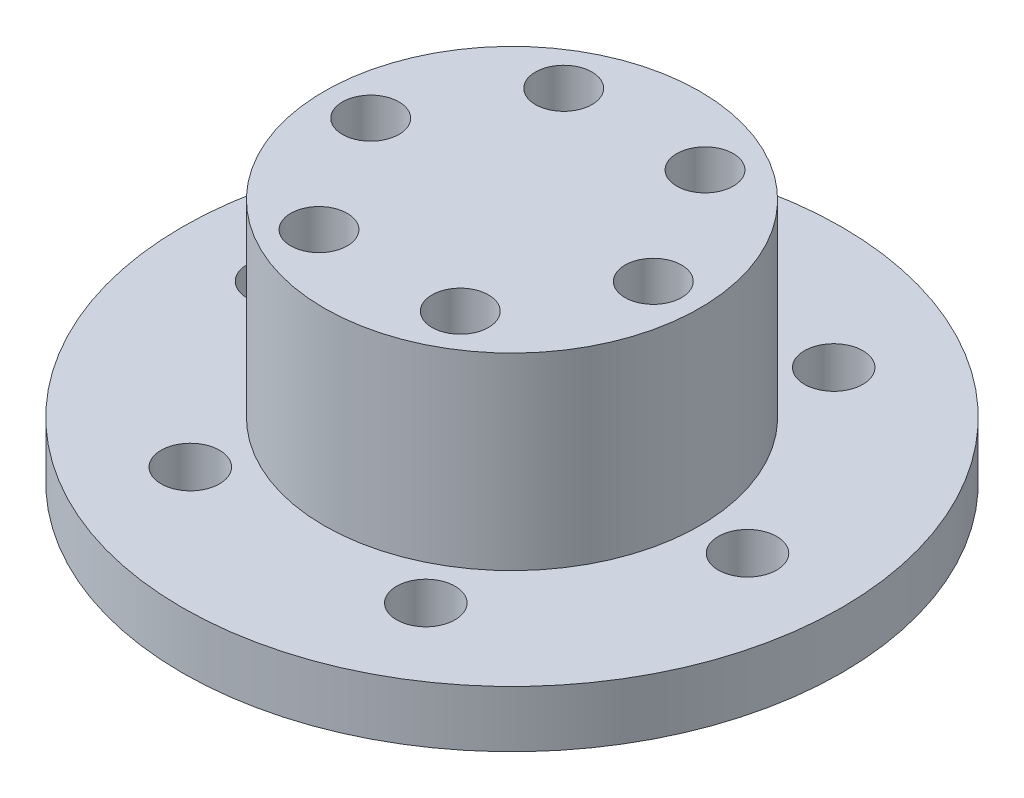
ISO-10303-21;
HEADER;
FILE_DESCRIPTION(('STEP AP214'),'2;1');
FILE_NAME('part.step','',(''),(''),'','','');
FILE_SCHEMA(('AUTOMOTIVE_DESIGN { 1 0 10303 214 1 1 1 1 }'));
ENDSEC;
DATA;
#1=APPLICATION_CONTEXT('core data for automotive mechanical design processes');
#2=APPLICATION_PROTOCOL_DEFINITION('international standard','automotive_design',2000,#1);
#3=PRODUCT_CONTEXT('',#1,'mechanical');
#4=PRODUCT('Part','Part','',(#3));
#5=PRODUCT_RELATED_PRODUCT_CATEGORY('part','',(#4));
#6=PRODUCT_DEFINITION_FORMATION('','',#4);
#7=PRODUCT_DEFINITION_CONTEXT('part definition',#1,'design');
#8=PRODUCT_DEFINITION('design','',#6,#7);
#9=PRODUCT_DEFINITION_SHAPE('','',#8);
#10=(LENGTH_UNIT() NAMED_UNIT(*) SI_UNIT(.MILLI.,.METRE.));
#11=(NAMED_UNIT(*) PLANE_ANGLE_UNIT() SI_UNIT($,.RADIAN.));
#12=(NAMED_UNIT(*) SI_UNIT($,.STERADIAN.) SOLID_ANGLE_UNIT());
#13=UNCERTAINTY_MEASURE_WITH_UNIT(LENGTH_MEASURE(1.E-05),#10,'distance_accuracy_value','');
#14=(GEOMETRIC_REPRESENTATION_CONTEXT(3) GLOBAL_UNCERTAINTY_ASSIGNED_CONTEXT((#13)) GLOBAL_UNIT_ASSIGNED_CONTEXT((#10,
#11,#12)) REPRESENTATION_CONTEXT('',''));
#15=CARTESIAN_POINT('',(0.,0.,0.));
#16=DIRECTION('',(0.,0.,1.));
#17=DIRECTION('',(1.,0.,0.));
#18=AXIS2_PLACEMENT_3D('',#15,#16,#17);
#19=CARTESIAN_POINT('',(0.,3.,0.));
#20=DIRECTION('',(0.,1.,0.));
#21=DIRECTION('',(0.,0.,1.));
#22=AXIS2_PLACEMENT_3D('',#19,#20,#21);
#23=PLANE('',#22);
#24=CARTESIAN_POINT('',(0.,3.,0.));
#25=DIRECTION('',(0.,1.,0.));
#26=DIRECTION('',(0.,0.,1.));
#27=AXIS2_PLACEMENT_3D('',#24,#25,#26);
#28=CIRCLE('',#27,9.97);
#29=CARTESIAN_POINT('',(0.,3.,9.97));
#30=VERTEX_POINT('',#29);
#31=EDGE_CURVE('E100',#30,#30,#28,.T.);
#32=ORIENTED_EDGE('',*,*,#31,.F.);
#33=EDGE_LOOP('',(#32));
#34=FACE_BOUND('',#33,.T.);
#35=CARTESIAN_POINT('',(-6.2499999999999,3.,-10.8253175473055));
#36=DIRECTION('',(0.,1.,0.));
#37=DIRECTION('',(0.,0.,1.));
#38=AXIS2_PLACEMENT_3D('',#35,#36,#37);
#39=CIRCLE('',#38,1.55);
#40=CARTESIAN_POINT('',(-6.2499999999999,3.,-9.27531754730554));
#41=VERTEX_POINT('',#40);
#42=EDGE_CURVE('E85',#41,#41,#39,.T.);
#43=ORIENTED_EDGE('',*,*,#42,.F.);
#44=EDGE_LOOP('',(#43));
#45=FACE_BOUND('',#44,.T.);
#46=CARTESIAN_POINT('',(-6.25000000000005,3.,10.8253175473055));
#47=DIRECTION('',(0.,1.,0.));
#48=DIRECTION('',(0.,0.,1.));
#49=AXIS2_PLACEMENT_3D('',#46,#47,#48);
#50=CIRCLE('',#49,1.55);
#51=CARTESIAN_POINT('',(-6.25000000000005,3.,12.3753175473055));
#52=VERTEX_POINT('',#51);
#53=EDGE_CURVE('E73',#52,#52,#50,.T.);
#54=ORIENTED_EDGE('',*,*,#53,.F.);
#55=EDGE_LOOP('',(#54));
#56=FACE_BOUND('',#55,.T.);
#57=CARTESIAN_POINT('',(12.5,3.,0.));
#58=DIRECTION('',(0.,1.,0.));
#59=DIRECTION('',(0.,0.,1.));
#60=AXIS2_PLACEMENT_3D('',#57,#58,#59);
#61=CIRCLE('',#60,1.55);
#62=CARTESIAN_POINT('',(12.5,3.,1.55));
#63=VERTEX_POINT('',#62);
#64=EDGE_CURVE('E61',#63,#63,#61,.T.);
#65=ORIENTED_EDGE('',*,*,#64,.F.);
#66=EDGE_LOOP('',(#65));
#67=FACE_BOUND('',#66,.T.);
#68=CARTESIAN_POINT('',(0.,3.,0.));
#69=DIRECTION('',(0.,1.,0.));
#70=DIRECTION('',(0.,0.,1.));
#71=AXIS2_PLACEMENT_3D('',#68,#69,#70);
#72=CIRCLE('',#71,17.5);
#73=CARTESIAN_POINT('',(0.,3.,17.5));
#74=VERTEX_POINT('',#73);
#75=EDGE_CURVE('E57',#74,#74,#72,.T.);
#76=ORIENTED_EDGE('',*,*,#75,.T.);
#77=EDGE_LOOP('',(#76));
#78=FACE_BOUND('',#77,.T.);
#79=CARTESIAN_POINT('',(6.24999999999998,3.,10.8253175473055));
#80=DIRECTION('',(0.,1.,0.));
#81=DIRECTION('',(0.,0.,1.));
#82=AXIS2_PLACEMENT_3D('',#79,#80,#81);
#83=CIRCLE('',#82,1.55);
#84=CARTESIAN_POINT('',(6.24999999999998,3.,12.3753175473055));
#85=VERTEX_POINT('',#84);
#86=EDGE_CURVE('E67',#85,#85,#83,.T.);
#87=ORIENTED_EDGE('',*,*,#86,.F.);
#88=EDGE_LOOP('',(#87));
#89=FACE_BOUND('',#88,.T.);
#90=CARTESIAN_POINT('',(-12.5,3.,0.));
#91=DIRECTION('',(0.,1.,0.));
#92=DIRECTION('',(0.,0.,1.));
#93=AXIS2_PLACEMENT_3D('',#90,#91,#92);
#94=CIRCLE('',#93,1.55);
#95=CARTESIAN_POINT('',(-12.5,3.,1.54999999999991));
#96=VERTEX_POINT('',#95);
#97=EDGE_CURVE('E79',#96,#96,#94,.T.);
#98=ORIENTED_EDGE('',*,*,#97,.F.);
#99=EDGE_LOOP('',(#98));
#100=FACE_BOUND('',#99,.T.);
#101=CARTESIAN_POINT('',(6.25000000000013,3.,-10.8253175473054));
#102=DIRECTION('',(0.,1.,0.));
#103=DIRECTION('',(0.,0.,1.));
#104=AXIS2_PLACEMENT_3D('',#101,#102,#103);
#105=CIRCLE('',#104,1.55);
#106=CARTESIAN_POINT('',(6.25000000000013,3.,-9.27531754730541));
#107=VERTEX_POINT('',#106);
#108=EDGE_CURVE('E91',#107,#107,#105,.T.);
#109=ORIENTED_EDGE('',*,*,#108,.F.);
#110=EDGE_LOOP('',(#109));
#111=FACE_BOUND('',#110,.T.);
#112=ADVANCED_FACE('F31',(#34,#45,#56,#67,#78,#89,#100,#111),#23,.T.);
#113=CARTESIAN_POINT('',(0.,0.,0.));
#114=DIRECTION('',(0.,1.,0.));
#115=DIRECTION('',(0.,0.,1.));
#116=AXIS2_PLACEMENT_3D('',#113,#114,#115);
#117=PLANE('',#116);
#118=CARTESIAN_POINT('',(0.,0.,0.));
#119=DIRECTION('',(0.,1.,0.));
#120=DIRECTION('',(0.,0.,1.));
#121=AXIS2_PLACEMENT_3D('',#118,#119,#120);
#122=CIRCLE('',#121,17.5);
#123=CARTESIAN_POINT('',(0.,0.,17.5));
#124=VERTEX_POINT('',#123);
#125=EDGE_CURVE('E58',#124,#124,#122,.T.);
#126=ORIENTED_EDGE('',*,*,#125,.F.);
#127=EDGE_LOOP('',(#126));
#128=FACE_BOUND('',#127,.T.);
#129=CARTESIAN_POINT('',(12.5,0.,0.));
#130=DIRECTION('',(0.,1.,0.));
#131=DIRECTION('',(0.,0.,1.));
#132=AXIS2_PLACEMENT_3D('',#129,#130,#131);
#133=CIRCLE('',#132,1.55);
#134=CARTESIAN_POINT('',(12.5,0.,1.55));
#135=VERTEX_POINT('',#134);
#136=EDGE_CURVE('E64',#135,#135,#133,.T.);
#137=ORIENTED_EDGE('',*,*,#136,.T.);
#138=EDGE_LOOP('',(#137));
#139=FACE_BOUND('',#138,.T.);
#140=CARTESIAN_POINT('',(6.24999999999998,0.,10.8253175473055));
#141=DIRECTION('',(0.,1.,0.));
#142=DIRECTION('',(0.,0.,1.));
#143=AXIS2_PLACEMENT_3D('',#140,#141,#142);
#144=CIRCLE('',#143,1.55);
#145=CARTESIAN_POINT('',(6.24999999999998,0.,12.3753175473055));
#146=VERTEX_POINT('',#145);
#147=EDGE_CURVE('E70',#146,#146,#144,.T.);
#148=ORIENTED_EDGE('',*,*,#147,.T.);
#149=EDGE_LOOP('',(#148));
#150=FACE_BOUND('',#149,.T.);
#151=CARTESIAN_POINT('',(-6.25000000000005,0.,10.8253175473055));
#152=DIRECTION('',(0.,1.,0.));
#153=DIRECTION('',(0.,0.,1.));
#154=AXIS2_PLACEMENT_3D('',#151,#152,#153);
#155=CIRCLE('',#154,1.55);
#156=CARTESIAN_POINT('',(-6.25000000000005,0.,12.3753175473055));
#157=VERTEX_POINT('',#156);
#158=EDGE_CURVE('E76',#157,#157,#155,.T.);
#159=ORIENTED_EDGE('',*,*,#158,.T.);
#160=EDGE_LOOP('',(#159));
#161=FACE_BOUND('',#160,.T.);
#162=CARTESIAN_POINT('',(-12.5,0.,0.));
#163=DIRECTION('',(0.,1.,0.));
#164=DIRECTION('',(0.,0.,1.));
#165=AXIS2_PLACEMENT_3D('',#162,#163,#164);
#166=CIRCLE('',#165,1.55);
#167=CARTESIAN_POINT('',(-12.5,0.,1.54999999999991));
#168=VERTEX_POINT('',#167);
#169=EDGE_CURVE('E82',#168,#168,#166,.T.);
#170=ORIENTED_EDGE('',*,*,#169,.T.);
#171=EDGE_LOOP('',(#170));
#172=FACE_BOUND('',#171,.T.);
#173=CARTESIAN_POINT('',(-6.2499999999999,0.,-10.8253175473055));
#174=DIRECTION('',(0.,1.,0.));
#175=DIRECTION('',(0.,0.,1.));
#176=AXIS2_PLACEMENT_3D('',#173,#174,#175);
#177=CIRCLE('',#176,1.55);
#178=CARTESIAN_POINT('',(-6.2499999999999,0.,-9.27531754730554));
#179=VERTEX_POINT('',#178);
#180=EDGE_CURVE('E88',#179,#179,#177,.T.);
#181=ORIENTED_EDGE('',*,*,#180,.T.);
#182=EDGE_LOOP('',(#181));
#183=FACE_BOUND('',#182,.T.);
#184=CARTESIAN_POINT('',(6.25000000000013,0.,-10.8253175473054));
#185=DIRECTION('',(0.,1.,0.));
#186=DIRECTION('',(0.,0.,1.));
#187=AXIS2_PLACEMENT_3D('',#184,#185,#186);
#188=CIRCLE('',#187,1.55);
#189=CARTESIAN_POINT('',(6.25000000000013,0.,-9.27531754730541));
#190=VERTEX_POINT('',#189);
#191=EDGE_CURVE('E94',#190,#190,#188,.T.);
#192=ORIENTED_EDGE('',*,*,#191,.T.);
#193=EDGE_LOOP('',(#192));
#194=FACE_BOUND('',#193,.T.);
#195=ADVANCED_FACE('F147',(#128,#139,#150,#161,#172,#183,#194),#117,.F.);
#196=CARTESIAN_POINT('',(0.,3.,0.));
#197=DIRECTION('',(0.,-1.,0.));
#198=DIRECTION('',(0.,0.,-1.));
#199=AXIS2_PLACEMENT_3D('',#196,#197,#198);
#200=CYLINDRICAL_SURFACE('',#199,17.5);
#201=ORIENTED_EDGE('',*,*,#75,.F.);
#202=EDGE_LOOP('',(#201));
#203=FACE_BOUND('',#202,.T.);
#204=ORIENTED_EDGE('',*,*,#125,.T.);
#205=EDGE_LOOP('',(#204));
#206=FACE_BOUND('',#205,.T.);
#207=ADVANCED_FACE('F33',(#203,#206),#200,.T.);
#208=CARTESIAN_POINT('',(12.5,3.,0.));
#209=DIRECTION('',(0.,-1.,0.));
#210=DIRECTION('',(0.,0.,-1.));
#211=AXIS2_PLACEMENT_3D('',#208,#209,#210);
#212=CYLINDRICAL_SURFACE('',#211,1.55);
#213=ORIENTED_EDGE('',*,*,#64,.T.);
#214=EDGE_LOOP('',(#213));
#215=FACE_BOUND('',#214,.T.);
#216=ORIENTED_EDGE('',*,*,#136,.F.);
#217=EDGE_LOOP('',(#216));
#218=FACE_BOUND('',#217,.T.);
#219=ADVANCED_FACE('F323',(#215,#218),#212,.F.);
#220=CARTESIAN_POINT('',(6.24999999999998,3.,10.8253175473055));
#221=DIRECTION('',(0.,-1.,0.));
#222=DIRECTION('',(0.,0.,-1.));
#223=AXIS2_PLACEMENT_3D('',#220,#221,#222);
#224=CYLINDRICAL_SURFACE('',#223,1.55);
#225=ORIENTED_EDGE('',*,*,#86,.T.);
#226=EDGE_LOOP('',(#225));
#227=FACE_BOUND('',#226,.T.);
#228=ORIENTED_EDGE('',*,*,#147,.F.);
#229=EDGE_LOOP('',(#228));
#230=FACE_BOUND('',#229,.T.);
#231=ADVANCED_FACE('F314',(#227,#230),#224,.F.);
#232=CARTESIAN_POINT('',(-6.25000000000005,3.,10.8253175473055));
#233=DIRECTION('',(0.,-1.,0.));
#234=DIRECTION('',(0.,0.,-1.));
#235=AXIS2_PLACEMENT_3D('',#232,#233,#234);
#236=CYLINDRICAL_SURFACE('',#235,1.55);
#237=ORIENTED_EDGE('',*,*,#53,.T.);
#238=EDGE_LOOP('',(#237));
#239=FACE_BOUND('',#238,.T.);
#240=ORIENTED_EDGE('',*,*,#158,.F.);
#241=EDGE_LOOP('',(#240));
#242=FACE_BOUND('',#241,.T.);
#243=ADVANCED_FACE('F305',(#239,#242),#236,.F.);
#244=CARTESIAN_POINT('',(-12.5,3.,0.));
#245=DIRECTION('',(0.,-1.,0.));
#246=DIRECTION('',(0.,0.,-1.));
#247=AXIS2_PLACEMENT_3D('',#244,#245,#246);
#248=CYLINDRICAL_SURFACE('',#247,1.55);
#249=ORIENTED_EDGE('',*,*,#97,.T.);
#250=EDGE_LOOP('',(#249));
#251=FACE_BOUND('',#250,.T.);
#252=ORIENTED_EDGE('',*,*,#169,.F.);
#253=EDGE_LOOP('',(#252));
#254=FACE_BOUND('',#253,.T.);
#255=ADVANCED_FACE('F296',(#251,#254),#248,.F.);
#256=CARTESIAN_POINT('',(-6.2499999999999,3.,-10.8253175473055));
#257=DIRECTION('',(0.,-1.,0.));
#258=DIRECTION('',(0.,0.,-1.));
#259=AXIS2_PLACEMENT_3D('',#256,#257,#258);
#260=CYLINDRICAL_SURFACE('',#259,1.55);
#261=ORIENTED_EDGE('',*,*,#42,.T.);
#262=EDGE_LOOP('',(#261));
#263=FACE_BOUND('',#262,.T.);
#264=ORIENTED_EDGE('',*,*,#180,.F.);
#265=EDGE_LOOP('',(#264));
#266=FACE_BOUND('',#265,.T.);
#267=ADVANCED_FACE('F140',(#263,#266),#260,.F.);
#268=CARTESIAN_POINT('',(6.25000000000013,3.,-10.8253175473054));
#269=DIRECTION('',(0.,-1.,0.));
#270=DIRECTION('',(0.,0.,-1.));
#271=AXIS2_PLACEMENT_3D('',#268,#269,#270);
#272=CYLINDRICAL_SURFACE('',#271,1.55);
#273=ORIENTED_EDGE('',*,*,#108,.T.);
#274=EDGE_LOOP('',(#273));
#275=FACE_BOUND('',#274,.T.);
#276=ORIENTED_EDGE('',*,*,#191,.F.);
#277=EDGE_LOOP('',(#276));
#278=FACE_BOUND('',#277,.T.);
#279=ADVANCED_FACE('F130',(#275,#278),#272,.F.);
#280=CARTESIAN_POINT('',(0.,13.,0.));
#281=DIRECTION('',(0.,1.,0.));
#282=DIRECTION('',(0.,0.,1.));
#283=AXIS2_PLACEMENT_3D('',#280,#281,#282);
#284=PLANE('',#283);
#285=CARTESIAN_POINT('',(-3.74999999999994,13.,-6.49519052838333));
#286=DIRECTION('',(0.,1.,0.));
#287=DIRECTION('',(0.,0.,1.));
#288=AXIS2_PLACEMENT_3D('',#285,#286,#287);
#289=CIRCLE('',#288,1.5);
#290=CARTESIAN_POINT('',(-3.74999999999994,13.,-4.99519052838333));
#291=VERTEX_POINT('',#290);
#292=EDGE_CURVE('E117',#291,#291,#289,.T.);
#293=ORIENTED_EDGE('',*,*,#292,.F.);
#294=EDGE_LOOP('',(#293));
#295=FACE_BOUND('',#294,.T.);
#296=CARTESIAN_POINT('',(-3.75000000000003,13.,6.49519052838327));
#297=DIRECTION('',(0.,1.,0.));
#298=DIRECTION('',(0.,0.,1.));
#299=AXIS2_PLACEMENT_3D('',#296,#297,#298);
#300=CIRCLE('',#299,1.5);
#301=CARTESIAN_POINT('',(-3.75000000000003,13.,7.99519052838327));
#302=VERTEX_POINT('',#301);
#303=EDGE_CURVE('E111',#302,#302,#300,.T.);
#304=ORIENTED_EDGE('',*,*,#303,.F.);
#305=EDGE_LOOP('',(#304));
#306=FACE_BOUND('',#305,.T.);
#307=CARTESIAN_POINT('',(7.5,13.,0.));
#308=DIRECTION('',(0.,1.,0.));
#309=DIRECTION('',(0.,0.,1.));
#310=AXIS2_PLACEMENT_3D('',#307,#308,#309);
#311=CIRCLE('',#310,1.5);
#312=CARTESIAN_POINT('',(7.5,13.,1.5));
#313=VERTEX_POINT('',#312);
#314=EDGE_CURVE('E103',#313,#313,#311,.T.);
#315=ORIENTED_EDGE('',*,*,#314,.F.);
#316=EDGE_LOOP('',(#315));
#317=FACE_BOUND('',#316,.T.);
#318=CARTESIAN_POINT('',(0.,13.,0.));
#319=DIRECTION('',(0.,1.,0.));
#320=DIRECTION('',(0.,0.,1.));
#321=AXIS2_PLACEMENT_3D('',#318,#319,#320);
#322=CIRCLE('',#321,9.97);
#323=CARTESIAN_POINT('',(0.,13.,9.97));
#324=VERTEX_POINT('',#323);
#325=EDGE_CURVE('E97',#324,#324,#322,.T.);
#326=ORIENTED_EDGE('',*,*,#325,.T.);
#327=EDGE_LOOP('',(#326));
#328=FACE_BOUND('',#327,.T.);
#329=CARTESIAN_POINT('',(3.74999999999998,13.,6.4951905283833));
#330=DIRECTION('',(0.,1.,0.));
#331=DIRECTION('',(0.,0.,1.));
#332=AXIS2_PLACEMENT_3D('',#329,#330,#331);
#333=CIRCLE('',#332,1.5);
#334=CARTESIAN_POINT('',(3.74999999999998,13.,7.9951905283833));
#335=VERTEX_POINT('',#334);
#336=EDGE_CURVE('E108',#335,#335,#333,.T.);
#337=ORIENTED_EDGE('',*,*,#336,.F.);
#338=EDGE_LOOP('',(#337));
#339=FACE_BOUND('',#338,.T.);
#340=CARTESIAN_POINT('',(-7.5,13.,0.));
#341=DIRECTION('',(0.,1.,0.));
#342=DIRECTION('',(0.,0.,1.));
#343=AXIS2_PLACEMENT_3D('',#340,#341,#342);
#344=CIRCLE('',#343,1.5);
#345=CARTESIAN_POINT('',(-7.5,13.,1.49999999999995));
#346=VERTEX_POINT('',#345);
#347=EDGE_CURVE('E114',#346,#346,#344,.T.);
#348=ORIENTED_EDGE('',*,*,#347,.F.);
#349=EDGE_LOOP('',(#348));
#350=FACE_BOUND('',#349,.T.);
#351=CARTESIAN_POINT('',(3.75000000000008,13.,-6.49519052838325));
#352=DIRECTION('',(0.,1.,0.));
#353=DIRECTION('',(0.,0.,1.));
#354=AXIS2_PLACEMENT_3D('',#351,#352,#353);
#355=CIRCLE('',#354,1.5);
#356=CARTESIAN_POINT('',(3.75000000000008,13.,-4.99519052838325));
#357=VERTEX_POINT('',#356);
#358=EDGE_CURVE('E120',#357,#357,#355,.T.);
#359=ORIENTED_EDGE('',*,*,#358,.F.);
#360=EDGE_LOOP('',(#359));
#361=FACE_BOUND('',#360,.T.);
#362=ADVANCED_FACE('F127',(#295,#306,#317,#328,#339,#350,#361),#284,.T.);
#363=CARTESIAN_POINT('',(0.,13.,0.));
#364=DIRECTION('',(0.,-1.,0.));
#365=DIRECTION('',(0.,0.,-1.));
#366=AXIS2_PLACEMENT_3D('',#363,#364,#365);
#367=CYLINDRICAL_SURFACE('',#366,9.97);
#368=ORIENTED_EDGE('',*,*,#325,.F.);
#369=EDGE_LOOP('',(#368));
#370=FACE_BOUND('',#369,.T.);
#371=ORIENTED_EDGE('',*,*,#31,.T.);
#372=EDGE_LOOP('',(#371));
#373=FACE_BOUND('',#372,.T.);
#374=ADVANCED_FACE('F129',(#370,#373),#367,.T.);
#375=CARTESIAN_POINT('',(7.5,13.,0.));
#376=DIRECTION('',(0.,-1.,0.));
#377=DIRECTION('',(0.,0.,-1.));
#378=AXIS2_PLACEMENT_3D('',#375,#376,#377);
#379=CYLINDRICAL_SURFACE('',#378,1.5);
#380=ORIENTED_EDGE('',*,*,#314,.T.);
#381=EDGE_LOOP('',(#380));
#382=FACE_BOUND('',#381,.T.);
#383=CARTESIAN_POINT('',(7.5,3.,0.));
#384=DIRECTION('',(0.,1.,0.));
#385=DIRECTION('',(0.,0.,1.));
#386=AXIS2_PLACEMENT_3D('',#383,#384,#385);
#387=CIRCLE('',#386,1.5);
#388=CARTESIAN_POINT('',(7.5,3.,1.5));
#389=VERTEX_POINT('',#388);
#390=EDGE_CURVE('E10',#389,#389,#387,.F.);
#391=ORIENTED_EDGE('',*,*,#390,.T.);
#392=EDGE_LOOP('',(#391));
#393=FACE_BOUND('',#392,.T.);
#394=ADVANCED_FACE('F137',(#382,#393),#379,.F.);
#395=CARTESIAN_POINT('',(3.74999999999998,13.,6.4951905283833));
#396=DIRECTION('',(0.,-1.,0.));
#397=DIRECTION('',(0.,0.,-1.));
#398=AXIS2_PLACEMENT_3D('',#395,#396,#397);
#399=CYLINDRICAL_SURFACE('',#398,1.5);
#400=ORIENTED_EDGE('',*,*,#336,.T.);
#401=EDGE_LOOP('',(#400));
#402=FACE_BOUND('',#401,.T.);
#403=CARTESIAN_POINT('',(3.74999999999998,3.,6.4951905283833));
#404=DIRECTION('',(0.,1.,0.));
#405=DIRECTION('',(0.,0.,1.));
#406=AXIS2_PLACEMENT_3D('',#403,#404,#405);
#407=CIRCLE('',#406,1.5);
#408=CARTESIAN_POINT('',(3.74999999999998,3.,7.9951905283833));
#409=VERTEX_POINT('',#408);
#410=EDGE_CURVE('E38',#409,#409,#407,.F.);
#411=ORIENTED_EDGE('',*,*,#410,.T.);
#412=EDGE_LOOP('',(#411));
#413=FACE_BOUND('',#412,.T.);
#414=ADVANCED_FACE('F187',(#402,#413),#399,.F.);
#415=CARTESIAN_POINT('',(-3.75000000000003,13.,6.49519052838327));
#416=DIRECTION('',(0.,-1.,0.));
#417=DIRECTION('',(0.,0.,-1.));
#418=AXIS2_PLACEMENT_3D('',#415,#416,#417);
#419=CYLINDRICAL_SURFACE('',#418,1.5);
#420=ORIENTED_EDGE('',*,*,#303,.T.);
#421=EDGE_LOOP('',(#420));
#422=FACE_BOUND('',#421,.T.);
#423=CARTESIAN_POINT('',(-3.75000000000003,3.,6.49519052838327));
#424=DIRECTION('',(0.,1.,0.));
#425=DIRECTION('',(0.,0.,1.));
#426=AXIS2_PLACEMENT_3D('',#423,#424,#425);
#427=CIRCLE('',#426,1.5);
#428=CARTESIAN_POINT('',(-3.75000000000003,3.,7.99519052838327));
#429=VERTEX_POINT('',#428);
#430=EDGE_CURVE('E42',#429,#429,#427,.F.);
#431=ORIENTED_EDGE('',*,*,#430,.T.);
#432=EDGE_LOOP('',(#431));
#433=FACE_BOUND('',#432,.T.);
#434=ADVANCED_FACE('F183',(#422,#433),#419,.F.);
#435=CARTESIAN_POINT('',(-7.5,13.,0.));
#436=DIRECTION('',(0.,-1.,0.));
#437=DIRECTION('',(0.,0.,-1.));
#438=AXIS2_PLACEMENT_3D('',#435,#436,#437);
#439=CYLINDRICAL_SURFACE('',#438,1.5);
#440=ORIENTED_EDGE('',*,*,#347,.T.);
#441=EDGE_LOOP('',(#440));
#442=FACE_BOUND('',#441,.T.);
#443=CARTESIAN_POINT('',(-7.5,3.,0.));
#444=DIRECTION('',(0.,1.,0.));
#445=DIRECTION('',(0.,0.,1.));
#446=AXIS2_PLACEMENT_3D('',#443,#444,#445);
#447=CIRCLE('',#446,1.5);
#448=CARTESIAN_POINT('',(-7.5,3.,1.49999999999995));
#449=VERTEX_POINT('',#448);
#450=EDGE_CURVE('E46',#449,#449,#447,.F.);
#451=ORIENTED_EDGE('',*,*,#450,.T.);
#452=EDGE_LOOP('',(#451));
#453=FACE_BOUND('',#452,.T.);
#454=ADVANCED_FACE('F177',(#442,#453),#439,.F.);
#455=CARTESIAN_POINT('',(-3.74999999999994,13.,-6.49519052838333));
#456=DIRECTION('',(0.,-1.,0.));
#457=DIRECTION('',(0.,0.,-1.));
#458=AXIS2_PLACEMENT_3D('',#455,#456,#457);
#459=CYLINDRICAL_SURFACE('',#458,1.5);
#460=ORIENTED_EDGE('',*,*,#292,.T.);
#461=EDGE_LOOP('',(#460));
#462=FACE_BOUND('',#461,.T.);
#463=CARTESIAN_POINT('',(-3.74999999999994,3.,-6.49519052838333));
#464=DIRECTION('',(0.,1.,0.));
#465=DIRECTION('',(0.,0.,1.));
#466=AXIS2_PLACEMENT_3D('',#463,#464,#465);
#467=CIRCLE('',#466,1.5);
#468=CARTESIAN_POINT('',(-3.74999999999994,3.,-4.99519052838333));
#469=VERTEX_POINT('',#468);
#470=EDGE_CURVE('E51',#469,#469,#467,.F.);
#471=ORIENTED_EDGE('',*,*,#470,.T.);
#472=EDGE_LOOP('',(#471));
#473=FACE_BOUND('',#472,.T.);
#474=ADVANCED_FACE('F171',(#462,#473),#459,.F.);
#475=CARTESIAN_POINT('',(3.75000000000008,13.,-6.49519052838325));
#476=DIRECTION('',(0.,-1.,0.));
#477=DIRECTION('',(0.,0.,-1.));
#478=AXIS2_PLACEMENT_3D('',#475,#476,#477);
#479=CYLINDRICAL_SURFACE('',#478,1.5);
#480=ORIENTED_EDGE('',*,*,#358,.T.);
#481=EDGE_LOOP('',(#480));
#482=FACE_BOUND('',#481,.T.);
#483=CARTESIAN_POINT('',(3.75000000000008,3.,-6.49519052838325));
#484=DIRECTION('',(0.,1.,0.));
#485=DIRECTION('',(0.,0.,1.));
#486=AXIS2_PLACEMENT_3D('',#483,#484,#485);
#487=CIRCLE('',#486,1.5);
#488=CARTESIAN_POINT('',(3.75000000000008,3.,-4.99519052838325));
#489=VERTEX_POINT('',#488);
#490=EDGE_CURVE('E54',#489,#489,#487,.F.);
#491=ORIENTED_EDGE('',*,*,#490,.T.);
#492=EDGE_LOOP('',(#491));
#493=FACE_BOUND('',#492,.T.);
#494=ADVANCED_FACE('F124',(#482,#493),#479,.F.);
#495=ORIENTED_EDGE('',*,*,#490,.F.);
#496=EDGE_LOOP('',(#495));
#497=FACE_BOUND('',#496,.T.);
#498=ADVANCED_FACE('F151',(#497),#23,.T.);
#499=ORIENTED_EDGE('',*,*,#470,.F.);
#500=EDGE_LOOP('',(#499));
#501=FACE_BOUND('',#500,.T.);
#502=ADVANCED_FACE('F163',(#501),#23,.T.);
#503=ORIENTED_EDGE('',*,*,#450,.F.);
#504=EDGE_LOOP('',(#503));
#505=FACE_BOUND('',#504,.T.);
#506=ADVANCED_FACE('F169',(#505),#23,.T.);
#507=ORIENTED_EDGE('',*,*,#430,.F.);
#508=EDGE_LOOP('',(#507));
#509=FACE_BOUND('',#508,.T.);
#510=ADVANCED_FACE('F207',(#509),#23,.T.);
#511=ORIENTED_EDGE('',*,*,#410,.F.);
#512=EDGE_LOOP('',(#511));
#513=FACE_BOUND('',#512,.T.);
#514=ADVANCED_FACE('F160',(#513),#23,.T.);
#515=ORIENTED_EDGE('',*,*,#390,.F.);
#516=EDGE_LOOP('',(#515));
#517=FACE_BOUND('',#516,.T.);
#518=ADVANCED_FACE('F150',(#517),#23,.T.);
#519=CLOSED_SHELL('',(#112,#195,#207,#219,#231,#243,#255,#267,#279,#362,#374,#394,#414,#434,
#454,#474,#494,#498,#502,#506,#510,#514,#518));
#520=MANIFOLD_SOLID_BREP('B2',#519);
#521=ADVANCED_BREP_SHAPE_REPRESENTATION('',(#18,#520),#14);
#522=SHAPE_DEFINITION_REPRESENTATION(#9,#521);
ENDSEC;
END-ISO-10303-21;
